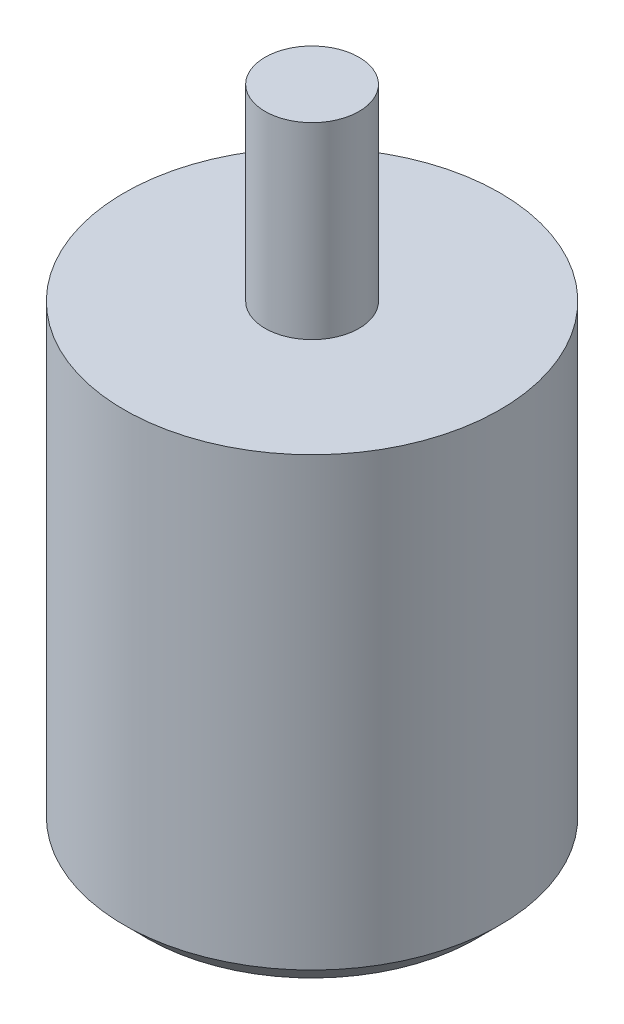
ISO-10303-21;
HEADER;
FILE_DESCRIPTION(('STEP AP214'),'2;1');
FILE_NAME('part.step','',(''),(''),'','','');
FILE_SCHEMA(('AUTOMOTIVE_DESIGN { 1 0 10303 214 1 1 1 1 }'));
ENDSEC;
DATA;
#1=APPLICATION_CONTEXT('core data for automotive mechanical design processes');
#2=APPLICATION_PROTOCOL_DEFINITION('international standard','automotive_design',2000,#1);
#3=PRODUCT_CONTEXT('',#1,'mechanical');
#4=PRODUCT('Part','Part','',(#3));
#5=PRODUCT_RELATED_PRODUCT_CATEGORY('part','',(#4));
#6=PRODUCT_DEFINITION_FORMATION('','',#4);
#7=PRODUCT_DEFINITION_CONTEXT('part definition',#1,'design');
#8=PRODUCT_DEFINITION('design','',#6,#7);
#9=PRODUCT_DEFINITION_SHAPE('','',#8);
#10=(LENGTH_UNIT() NAMED_UNIT(*) SI_UNIT(.MILLI.,.METRE.));
#11=(NAMED_UNIT(*) PLANE_ANGLE_UNIT() SI_UNIT($,.RADIAN.));
#12=(NAMED_UNIT(*) SI_UNIT($,.STERADIAN.) SOLID_ANGLE_UNIT());
#13=UNCERTAINTY_MEASURE_WITH_UNIT(LENGTH_MEASURE(1.E-05),#10,'distance_accuracy_value','');
#14=(GEOMETRIC_REPRESENTATION_CONTEXT(3) GLOBAL_UNCERTAINTY_ASSIGNED_CONTEXT((#13)) GLOBAL_UNIT_ASSIGNED_CONTEXT((#10,
#11,#12)) REPRESENTATION_CONTEXT('',''));
#15=CARTESIAN_POINT('',(0.,0.,0.));
#16=DIRECTION('',(0.,0.,1.));
#17=DIRECTION('',(1.,0.,0.));
#18=AXIS2_PLACEMENT_3D('',#15,#16,#17);
#19=CARTESIAN_POINT('',(12.7,0.,0.));
#20=DIRECTION('',(0.,-1.,0.));
#21=DIRECTION('',(0.,0.,-1.));
#22=AXIS2_PLACEMENT_3D('',#19,#20,#21);
#23=PLANE('',#22);
#24=CARTESIAN_POINT('',(0.,0.,0.));
#25=DIRECTION('',(0.,-1.,0.));
#26=DIRECTION('',(0.,0.,-1.));
#27=AXIS2_PLACEMENT_3D('',#24,#25,#26);
#28=CIRCLE('',#27,11.1125);
#29=CARTESIAN_POINT('',(0.,0.,-11.1125));
#30=VERTEX_POINT('',#29);
#31=EDGE_CURVE('E47',#30,#30,#28,.T.);
#32=ORIENTED_EDGE('',*,*,#31,.T.);
#33=EDGE_LOOP('',(#32));
#34=FACE_BOUND('',#33,.T.);
#35=ADVANCED_FACE('F39',(#34),#23,.T.);
#36=CARTESIAN_POINT('',(0.,44.45,0.));
#37=DIRECTION('',(0.,1.,0.));
#38=DIRECTION('',(0.,0.,1.));
#39=AXIS2_PLACEMENT_3D('',#36,#37,#38);
#40=PLANE('',#39);
#41=CARTESIAN_POINT('',(0.,44.45,0.));
#42=DIRECTION('',(0.,-1.,0.));
#43=DIRECTION('',(0.,0.,-1.));
#44=AXIS2_PLACEMENT_3D('',#41,#42,#43);
#45=CIRCLE('',#44,3.175);
#46=CARTESIAN_POINT('',(0.,44.45,-3.175));
#47=VERTEX_POINT('',#46);
#48=EDGE_CURVE('E52',#47,#47,#45,.T.);
#49=ORIENTED_EDGE('',*,*,#48,.F.);
#50=EDGE_LOOP('',(#49));
#51=FACE_BOUND('',#50,.T.);
#52=ADVANCED_FACE('F80',(#51),#40,.T.);
#53=CARTESIAN_POINT('',(0.,0.,0.));
#54=DIRECTION('',(0.,-1.,0.));
#55=DIRECTION('',(0.,0.,-1.));
#56=AXIS2_PLACEMENT_3D('',#53,#54,#55);
#57=CYLINDRICAL_SURFACE('',#56,3.175);
#58=ORIENTED_EDGE('',*,*,#48,.T.);
#59=EDGE_LOOP('',(#58));
#60=FACE_BOUND('',#59,.T.);
#61=CARTESIAN_POINT('',(0.,31.75,0.));
#62=DIRECTION('',(0.,-1.,0.));
#63=DIRECTION('',(0.,0.,-1.));
#64=AXIS2_PLACEMENT_3D('',#61,#62,#63);
#65=CIRCLE('',#64,3.175);
#66=CARTESIAN_POINT('',(0.,31.75,-3.175));
#67=VERTEX_POINT('',#66);
#68=EDGE_CURVE('E57',#67,#67,#65,.T.);
#69=ORIENTED_EDGE('',*,*,#68,.F.);
#70=EDGE_LOOP('',(#69));
#71=FACE_BOUND('',#70,.T.);
#72=ADVANCED_FACE('F72',(#60,#71),#57,.T.);
#73=CARTESIAN_POINT('',(3.175,31.75,0.));
#74=DIRECTION('',(0.,1.,0.));
#75=DIRECTION('',(0.,0.,1.));
#76=AXIS2_PLACEMENT_3D('',#73,#74,#75);
#77=PLANE('',#76);
#78=ORIENTED_EDGE('',*,*,#68,.T.);
#79=EDGE_LOOP('',(#78));
#80=FACE_BOUND('',#79,.T.);
#81=CARTESIAN_POINT('',(0.,31.75,0.));
#82=DIRECTION('',(0.,-1.,0.));
#83=DIRECTION('',(0.,0.,-1.));
#84=AXIS2_PLACEMENT_3D('',#81,#82,#83);
#85=CIRCLE('',#84,12.7);
#86=CARTESIAN_POINT('',(0.,31.75,-12.7));
#87=VERTEX_POINT('',#86);
#88=EDGE_CURVE('E63',#87,#87,#85,.T.);
#89=ORIENTED_EDGE('',*,*,#88,.F.);
#90=EDGE_LOOP('',(#89));
#91=FACE_BOUND('',#90,.T.);
#92=ADVANCED_FACE('F70',(#80,#91),#77,.T.);
#93=CARTESIAN_POINT('',(0.,0.,0.));
#94=DIRECTION('',(0.,-1.,0.));
#95=DIRECTION('',(0.,0.,-1.));
#96=AXIS2_PLACEMENT_3D('',#93,#94,#95);
#97=CYLINDRICAL_SURFACE('',#96,12.7);
#98=CARTESIAN_POINT('',(0.,1.5875,0.));
#99=DIRECTION('',(0.,-1.,0.));
#100=DIRECTION('',(0.,0.,-1.));
#101=AXIS2_PLACEMENT_3D('',#98,#99,#100);
#102=CIRCLE('',#101,12.7);
#103=CARTESIAN_POINT('',(0.,1.5875,-12.7));
#104=VERTEX_POINT('',#103);
#105=EDGE_CURVE('E10',#104,#104,#102,.F.);
#106=ORIENTED_EDGE('',*,*,#105,.T.);
#107=EDGE_LOOP('',(#106));
#108=FACE_BOUND('',#107,.T.);
#109=ORIENTED_EDGE('',*,*,#88,.T.);
#110=EDGE_LOOP('',(#109));
#111=FACE_BOUND('',#110,.T.);
#112=ADVANCED_FACE('F68',(#108,#111),#97,.T.);
#113=CARTESIAN_POINT('',(0.,0.,0.));
#114=DIRECTION('',(0.,1.,0.));
#115=DIRECTION('',(0.,0.,1.));
#116=AXIS2_PLACEMENT_3D('',#113,#114,#115);
#117=CONICAL_SURFACE('',#116,11.1125,0.785398163397447);
#118=ORIENTED_EDGE('',*,*,#105,.F.);
#119=EDGE_LOOP('',(#118));
#120=FACE_BOUND('',#119,.T.);
#121=ORIENTED_EDGE('',*,*,#31,.F.);
#122=EDGE_LOOP('',(#121));
#123=FACE_BOUND('',#122,.T.);
#124=ADVANCED_FACE('F41',(#120,#123),#117,.T.);
#125=CLOSED_SHELL('',(#35,#52,#72,#92,#112,#124));
#126=MANIFOLD_SOLID_BREP('B2',#125);
#127=ADVANCED_BREP_SHAPE_REPRESENTATION('',(#18,#126),#14);
#128=SHAPE_DEFINITION_REPRESENTATION(#9,#127);
ENDSEC;
END-ISO-10303-21;
